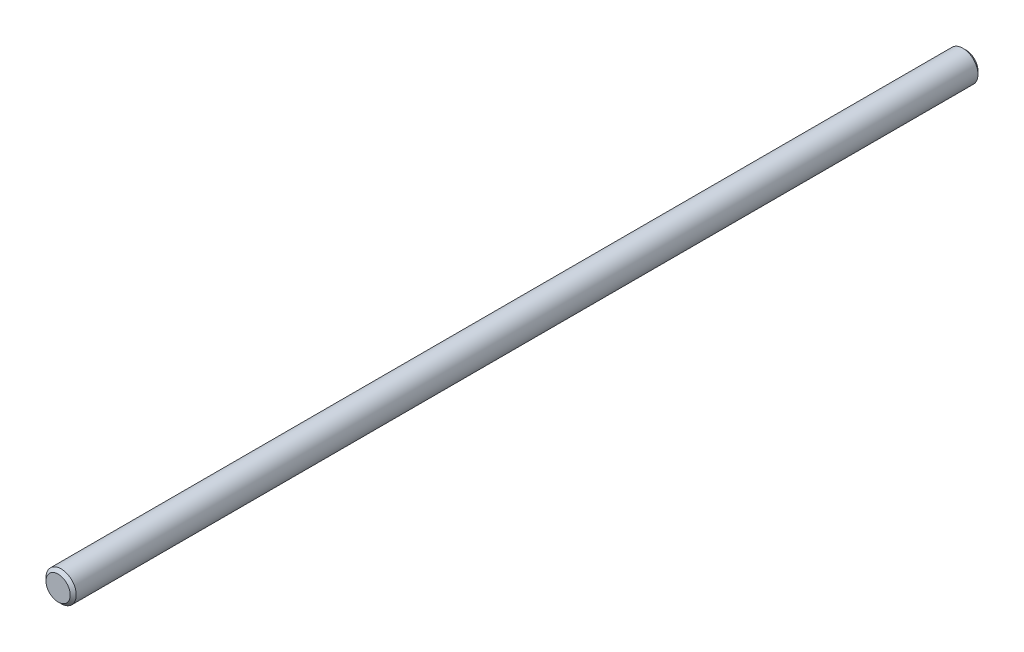
ISO-10303-21;
HEADER;
FILE_DESCRIPTION(('STEP AP214'),'2;1');
FILE_NAME('part.step','',(''),(''),'','','');
FILE_SCHEMA(('AUTOMOTIVE_DESIGN { 1 0 10303 214 1 1 1 1 }'));
ENDSEC;
DATA;
#1=APPLICATION_CONTEXT('core data for automotive mechanical design processes');
#2=APPLICATION_PROTOCOL_DEFINITION('international standard','automotive_design',2000,#1);
#3=PRODUCT_CONTEXT('',#1,'mechanical');
#4=PRODUCT('Part','Part','',(#3));
#5=PRODUCT_RELATED_PRODUCT_CATEGORY('part','',(#4));
#6=PRODUCT_DEFINITION_FORMATION('','',#4);
#7=PRODUCT_DEFINITION_CONTEXT('part definition',#1,'design');
#8=PRODUCT_DEFINITION('design','',#6,#7);
#9=PRODUCT_DEFINITION_SHAPE('','',#8);
#10=(LENGTH_UNIT() NAMED_UNIT(*) SI_UNIT(.MILLI.,.METRE.));
#11=(NAMED_UNIT(*) PLANE_ANGLE_UNIT() SI_UNIT($,.RADIAN.));
#12=(NAMED_UNIT(*) SI_UNIT($,.STERADIAN.) SOLID_ANGLE_UNIT());
#13=UNCERTAINTY_MEASURE_WITH_UNIT(LENGTH_MEASURE(1.E-05),#10,'distance_accuracy_value','');
#14=(GEOMETRIC_REPRESENTATION_CONTEXT(3) GLOBAL_UNCERTAINTY_ASSIGNED_CONTEXT((#13)) GLOBAL_UNIT_ASSIGNED_CONTEXT((#10,
#11,#12)) REPRESENTATION_CONTEXT('',''));
#15=CARTESIAN_POINT('',(0.,0.,0.));
#16=DIRECTION('',(0.,0.,1.));
#17=DIRECTION('',(1.,0.,0.));
#18=AXIS2_PLACEMENT_3D('',#15,#16,#17);
#19=CARTESIAN_POINT('',(0.,0.,300.));
#20=DIRECTION('',(0.,0.,-1.));
#21=DIRECTION('',(-1.,0.,0.));
#22=AXIS2_PLACEMENT_3D('',#19,#20,#21);
#23=CYLINDRICAL_SURFACE('',#22,10.);
#24=CARTESIAN_POINT('',(0.,0.,-298.));
#25=DIRECTION('',(0.,0.,1.));
#26=DIRECTION('',(1.,0.,0.));
#27=AXIS2_PLACEMENT_3D('',#24,#25,#26);
#28=CIRCLE('',#27,10.);
#29=CARTESIAN_POINT('',(10.,0.,-298.));
#30=VERTEX_POINT('',#29);
#31=EDGE_CURVE('E41',#30,#30,#28,.T.);
#32=ORIENTED_EDGE('',*,*,#31,.T.);
#33=EDGE_LOOP('',(#32));
#34=FACE_BOUND('',#33,.T.);
#35=CARTESIAN_POINT('',(0.,0.,298.));
#36=DIRECTION('',(0.,0.,1.));
#37=DIRECTION('',(1.,0.,0.));
#38=AXIS2_PLACEMENT_3D('',#35,#36,#37);
#39=CIRCLE('',#38,10.);
#40=CARTESIAN_POINT('',(10.,0.,298.));
#41=VERTEX_POINT('',#40);
#42=EDGE_CURVE('E45',#41,#41,#39,.F.);
#43=ORIENTED_EDGE('',*,*,#42,.T.);
#44=EDGE_LOOP('',(#43));
#45=FACE_BOUND('',#44,.T.);
#46=ADVANCED_FACE('F30',(#34,#45),#23,.T.);
#47=CARTESIAN_POINT('',(0.,0.,300.));
#48=DIRECTION('',(0.,0.,1.));
#49=DIRECTION('',(1.,0.,0.));
#50=AXIS2_PLACEMENT_3D('',#47,#48,#49);
#51=PLANE('',#50);
#52=CARTESIAN_POINT('',(0.,0.,300.));
#53=DIRECTION('',(0.,0.,1.));
#54=DIRECTION('',(1.,0.,0.));
#55=AXIS2_PLACEMENT_3D('',#52,#53,#54);
#56=CIRCLE('',#55,7.99999999999995);
#57=CARTESIAN_POINT('',(7.99999999999995,0.,300.));
#58=VERTEX_POINT('',#57);
#59=EDGE_CURVE('E10',#58,#58,#56,.T.);
#60=ORIENTED_EDGE('',*,*,#59,.T.);
#61=EDGE_LOOP('',(#60));
#62=FACE_BOUND('',#61,.T.);
#63=ADVANCED_FACE('F61',(#62),#51,.T.);
#64=CARTESIAN_POINT('',(0.,0.,-300.));
#65=DIRECTION('',(0.,0.,1.));
#66=DIRECTION('',(1.,0.,0.));
#67=AXIS2_PLACEMENT_3D('',#64,#65,#66);
#68=PLANE('',#67);
#69=CARTESIAN_POINT('',(0.,0.,-300.));
#70=DIRECTION('',(0.,0.,1.));
#71=DIRECTION('',(1.,0.,0.));
#72=AXIS2_PLACEMENT_3D('',#69,#70,#71);
#73=CIRCLE('',#72,8.00000000000006);
#74=CARTESIAN_POINT('',(8.00000000000006,0.,-300.));
#75=VERTEX_POINT('',#74);
#76=EDGE_CURVE('E37',#75,#75,#73,.F.);
#77=ORIENTED_EDGE('',*,*,#76,.T.);
#78=EDGE_LOOP('',(#77));
#79=FACE_BOUND('',#78,.T.);
#80=ADVANCED_FACE('F58',(#79),#68,.F.);
#81=CARTESIAN_POINT('',(0.,0.,-298.));
#82=DIRECTION('',(0.,0.,1.));
#83=DIRECTION('',(1.,0.,0.));
#84=AXIS2_PLACEMENT_3D('',#81,#82,#83);
#85=CONICAL_SURFACE('',#84,10.,0.78539816339746);
#86=ORIENTED_EDGE('',*,*,#76,.F.);
#87=EDGE_LOOP('',(#86));
#88=FACE_BOUND('',#87,.T.);
#89=ORIENTED_EDGE('',*,*,#31,.F.);
#90=EDGE_LOOP('',(#89));
#91=FACE_BOUND('',#90,.T.);
#92=ADVANCED_FACE('F54',(#88,#91),#85,.T.);
#93=CARTESIAN_POINT('',(0.,0.,300.));
#94=DIRECTION('',(0.,0.,-1.));
#95=DIRECTION('',(-1.,0.,0.));
#96=AXIS2_PLACEMENT_3D('',#93,#94,#95);
#97=CONICAL_SURFACE('',#96,7.99999999999995,0.78539816339746);
#98=ORIENTED_EDGE('',*,*,#42,.F.);
#99=EDGE_LOOP('',(#98));
#100=FACE_BOUND('',#99,.T.);
#101=ORIENTED_EDGE('',*,*,#59,.F.);
#102=EDGE_LOOP('',(#101));
#103=FACE_BOUND('',#102,.T.);
#104=ADVANCED_FACE('F32',(#100,#103),#97,.T.);
#105=CLOSED_SHELL('',(#46,#63,#80,#92,#104));
#106=MANIFOLD_SOLID_BREP('B2',#105);
#107=ADVANCED_BREP_SHAPE_REPRESENTATION('',(#18,#106),#14);
#108=SHAPE_DEFINITION_REPRESENTATION(#9,#107);
ENDSEC;
END-ISO-10303-21;
